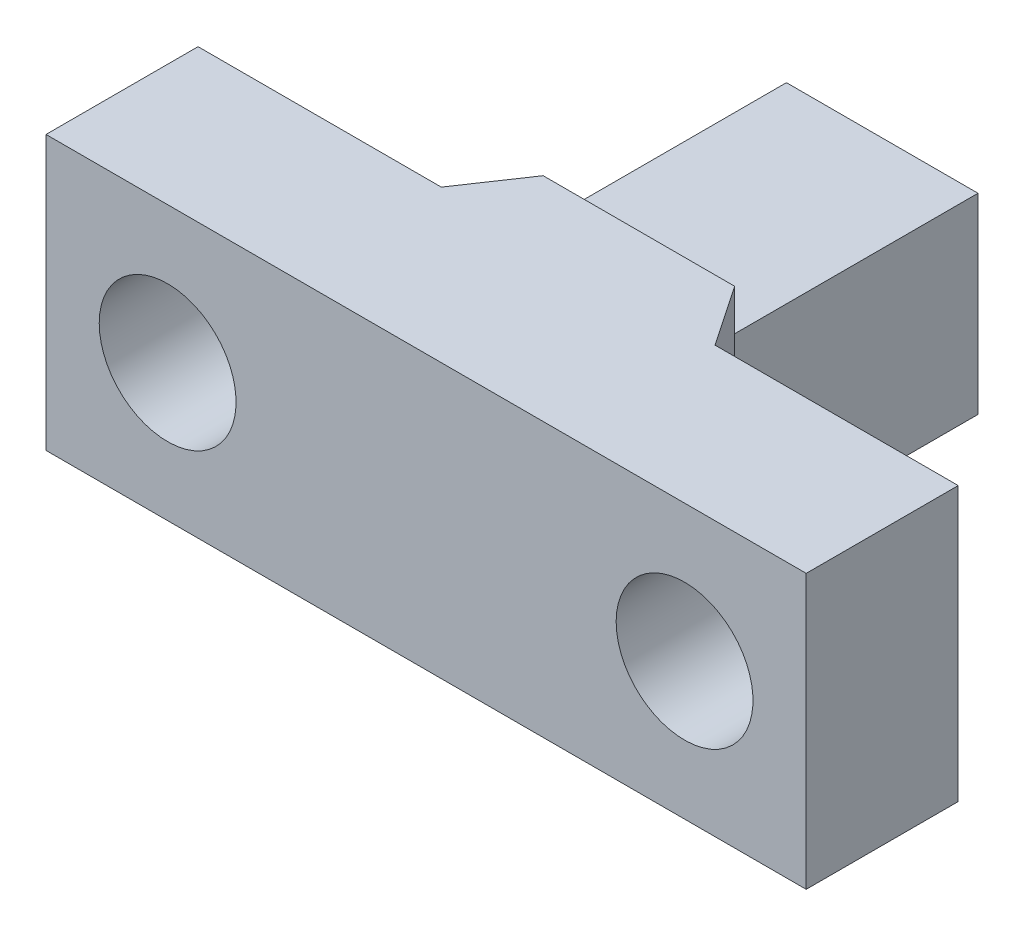
ISO-10303-21;
HEADER;
FILE_DESCRIPTION(('STEP AP214'),'2;1');
FILE_NAME('part.step','',(''),(''),'','','');
FILE_SCHEMA(('AUTOMOTIVE_DESIGN { 1 0 10303 214 1 1 1 1 }'));
ENDSEC;
DATA;
#1=APPLICATION_CONTEXT('core data for automotive mechanical design processes');
#2=APPLICATION_PROTOCOL_DEFINITION('international standard','automotive_design',2000,#1);
#3=PRODUCT_CONTEXT('',#1,'mechanical');
#4=PRODUCT('Part','Part','',(#3));
#5=PRODUCT_RELATED_PRODUCT_CATEGORY('part','',(#4));
#6=PRODUCT_DEFINITION_FORMATION('','',#4);
#7=PRODUCT_DEFINITION_CONTEXT('part definition',#1,'design');
#8=PRODUCT_DEFINITION('design','',#6,#7);
#9=PRODUCT_DEFINITION_SHAPE('','',#8);
#10=(LENGTH_UNIT() NAMED_UNIT(*) SI_UNIT(.MILLI.,.METRE.));
#11=(NAMED_UNIT(*) PLANE_ANGLE_UNIT() SI_UNIT($,.RADIAN.));
#12=(NAMED_UNIT(*) SI_UNIT($,.STERADIAN.) SOLID_ANGLE_UNIT());
#13=UNCERTAINTY_MEASURE_WITH_UNIT(LENGTH_MEASURE(1.E-05),#10,'distance_accuracy_value','');
#14=(GEOMETRIC_REPRESENTATION_CONTEXT(3) GLOBAL_UNCERTAINTY_ASSIGNED_CONTEXT((#13)) GLOBAL_UNIT_ASSIGNED_CONTEXT((#10,
#11,#12)) REPRESENTATION_CONTEXT('',''));
#15=CARTESIAN_POINT('',(0.,0.,0.));
#16=DIRECTION('',(0.,0.,1.));
#17=DIRECTION('',(1.,0.,0.));
#18=AXIS2_PLACEMENT_3D('',#15,#16,#17);
#19=CARTESIAN_POINT('',(0.,0.,-7.));
#20=DIRECTION('',(0.,0.,-1.));
#21=DIRECTION('',(-1.,0.,0.));
#22=AXIS2_PLACEMENT_3D('',#19,#20,#21);
#23=PLANE('',#22);
#24=DIRECTION('',(-1.,0.,0.));
#25=VECTOR('',#24,1.);
#26=CARTESIAN_POINT('',(17.,0.,-7.));
#27=LINE('',#26,#25);
#28=CARTESIAN_POINT('',(15.65,0.,-7.));
#29=VERTEX_POINT('',#28);
#30=CARTESIAN_POINT('',(9.35,0.,-7.));
#31=VERTEX_POINT('',#30);
#32=EDGE_CURVE('E201',#29,#31,#27,.T.);
#33=ORIENTED_EDGE('',*,*,#32,.T.);
#34=DIRECTION('',(0.,1.,0.));
#35=VECTOR('',#34,1.);
#36=CARTESIAN_POINT('',(9.35,9.,-7.));
#37=LINE('',#36,#35);
#38=CARTESIAN_POINT('',(9.35,1.35,-7.));
#39=VERTEX_POINT('',#38);
#40=EDGE_CURVE('E155',#31,#39,#37,.T.);
#41=ORIENTED_EDGE('',*,*,#40,.T.);
#42=DIRECTION('',(-1.,0.,0.));
#43=VECTOR('',#42,1.);
#44=CARTESIAN_POINT('',(15.65,1.35,-7.));
#45=LINE('',#44,#43);
#46=CARTESIAN_POINT('',(15.65,1.35,-7.));
#47=VERTEX_POINT('',#46);
#48=EDGE_CURVE('E137',#47,#39,#45,.T.);
#49=ORIENTED_EDGE('',*,*,#48,.F.);
#50=DIRECTION('',(0.,-1.,0.));
#51=VECTOR('',#50,1.);
#52=CARTESIAN_POINT('',(15.65,0.,-7.));
#53=LINE('',#52,#51);
#54=EDGE_CURVE('E152',#47,#29,#53,.T.);
#55=ORIENTED_EDGE('',*,*,#54,.T.);
#56=EDGE_LOOP('',(#33,#41,#49,#55));
#57=FACE_BOUND('',#56,.T.);
#58=ADVANCED_FACE('F42',(#57),#23,.T.);
#59=CARTESIAN_POINT('',(0.,9.,0.));
#60=DIRECTION('',(0.,1.,0.));
#61=DIRECTION('',(0.,0.,1.));
#62=AXIS2_PLACEMENT_3D('',#59,#60,#61);
#63=PLANE('',#62);
#64=DIRECTION('',(1.,0.,0.));
#65=VECTOR('',#64,1.);
#66=CARTESIAN_POINT('',(17.,9.,-7.));
#67=LINE('',#66,#65);
#68=CARTESIAN_POINT('',(9.35,9.,-7.));
#69=VERTEX_POINT('',#68);
#70=CARTESIAN_POINT('',(15.65,9.,-7.));
#71=VERTEX_POINT('',#70);
#72=EDGE_CURVE('E258',#69,#71,#67,.T.);
#73=ORIENTED_EDGE('',*,*,#72,.F.);
#74=DIRECTION('',(-0.559472855001061,0.,0.828848674075649));
#75=VECTOR('',#74,1.);
#76=CARTESIAN_POINT('',(3.17732932589096,9.,2.14469729497639));
#77=LINE('',#76,#75);
#78=CARTESIAN_POINT('',(8.,9.,-5.));
#79=VERTEX_POINT('',#78);
#80=EDGE_CURVE('E191',#69,#79,#77,.T.);
#81=ORIENTED_EDGE('',*,*,#80,.T.);
#82=DIRECTION('',(-1.,0.,0.));
#83=VECTOR('',#82,1.);
#84=CARTESIAN_POINT('',(8.,9.,-5.));
#85=LINE('',#84,#83);
#86=CARTESIAN_POINT('',(0.,9.,-5.));
#87=VERTEX_POINT('',#86);
#88=EDGE_CURVE('E244',#79,#87,#85,.T.);
#89=ORIENTED_EDGE('',*,*,#88,.T.);
#90=DIRECTION('',(0.,0.,1.));
#91=VECTOR('',#90,1.);
#92=CARTESIAN_POINT('',(0.,9.,-5.));
#93=LINE('',#92,#91);
#94=CARTESIAN_POINT('',(0.,9.,0.));
#95=VERTEX_POINT('',#94);
#96=EDGE_CURVE('E241',#87,#95,#93,.T.);
#97=ORIENTED_EDGE('',*,*,#96,.T.);
#98=DIRECTION('',(1.,0.,0.));
#99=VECTOR('',#98,1.);
#100=CARTESIAN_POINT('',(0.,9.,0.));
#101=LINE('',#100,#99);
#102=CARTESIAN_POINT('',(25.,9.,0.));
#103=VERTEX_POINT('',#102);
#104=EDGE_CURVE('E267',#95,#103,#101,.T.);
#105=ORIENTED_EDGE('',*,*,#104,.T.);
#106=DIRECTION('',(0.,0.,-1.));
#107=VECTOR('',#106,1.);
#108=CARTESIAN_POINT('',(25.,9.,0.));
#109=LINE('',#108,#107);
#110=CARTESIAN_POINT('',(25.,9.,-5.));
#111=VERTEX_POINT('',#110);
#112=EDGE_CURVE('E229',#103,#111,#109,.T.);
#113=ORIENTED_EDGE('',*,*,#112,.T.);
#114=DIRECTION('',(-1.,0.,0.));
#115=VECTOR('',#114,1.);
#116=CARTESIAN_POINT('',(25.,9.,-5.));
#117=LINE('',#116,#115);
#118=CARTESIAN_POINT('',(17.,9.,-5.));
#119=VERTEX_POINT('',#118);
#120=EDGE_CURVE('E250',#111,#119,#117,.T.);
#121=ORIENTED_EDGE('',*,*,#120,.T.);
#122=DIRECTION('',(-0.559472855001065,0.,-0.828848674075647));
#123=VECTOR('',#122,1.);
#124=CARTESIAN_POINT('',(13.997423787033,9.,-9.44826105624736));
#125=LINE('',#124,#123);
#126=EDGE_CURVE('E59',#119,#71,#125,.T.);
#127=ORIENTED_EDGE('',*,*,#126,.T.);
#128=EDGE_LOOP('',(#73,#81,#89,#97,#105,#113,#121,#127));
#129=FACE_BOUND('',#128,.T.);
#130=ADVANCED_FACE('F270',(#129),#63,.T.);
#131=CARTESIAN_POINT('',(0.,0.,0.));
#132=DIRECTION('',(0.,1.,0.));
#133=DIRECTION('',(0.,0.,1.));
#134=AXIS2_PLACEMENT_3D('',#131,#132,#133);
#135=PLANE('',#134);
#136=DIRECTION('',(-1.,0.,0.));
#137=VECTOR('',#136,1.);
#138=CARTESIAN_POINT('',(8.,0.,-5.));
#139=LINE('',#138,#137);
#140=CARTESIAN_POINT('',(8.,0.,-5.));
#141=VERTEX_POINT('',#140);
#142=CARTESIAN_POINT('',(0.,0.,-5.));
#143=VERTEX_POINT('',#142);
#144=EDGE_CURVE('E211',#141,#143,#139,.T.);
#145=ORIENTED_EDGE('',*,*,#144,.F.);
#146=DIRECTION('',(0.559472855001061,0.,-0.828848674075649));
#147=VECTOR('',#146,1.);
#148=CARTESIAN_POINT('',(9.35,0.,-7.));
#149=LINE('',#148,#147);
#150=EDGE_CURVE('E11',#141,#31,#149,.T.);
#151=ORIENTED_EDGE('',*,*,#150,.T.);
#152=ORIENTED_EDGE('',*,*,#32,.F.);
#153=DIRECTION('',(0.559472855001065,0.,0.828848674075647));
#154=VECTOR('',#153,1.);
#155=CARTESIAN_POINT('',(15.65,0.,-7.));
#156=LINE('',#155,#154);
#157=CARTESIAN_POINT('',(17.,0.,-5.));
#158=VERTEX_POINT('',#157);
#159=EDGE_CURVE('E52',#29,#158,#156,.T.);
#160=ORIENTED_EDGE('',*,*,#159,.T.);
#161=DIRECTION('',(-1.,0.,0.));
#162=VECTOR('',#161,1.);
#163=CARTESIAN_POINT('',(25.,0.,-5.));
#164=LINE('',#163,#162);
#165=CARTESIAN_POINT('',(25.,0.,-5.));
#166=VERTEX_POINT('',#165);
#167=EDGE_CURVE('E200',#166,#158,#164,.T.);
#168=ORIENTED_EDGE('',*,*,#167,.F.);
#169=DIRECTION('',(0.,0.,-1.));
#170=VECTOR('',#169,1.);
#171=CARTESIAN_POINT('',(25.,0.,0.));
#172=LINE('',#171,#170);
#173=CARTESIAN_POINT('',(25.,0.,0.));
#174=VERTEX_POINT('',#173);
#175=EDGE_CURVE('E212',#174,#166,#172,.T.);
#176=ORIENTED_EDGE('',*,*,#175,.F.);
#177=DIRECTION('',(1.,0.,0.));
#178=VECTOR('',#177,1.);
#179=CARTESIAN_POINT('',(0.,0.,0.));
#180=LINE('',#179,#178);
#181=CARTESIAN_POINT('',(0.,0.,0.));
#182=VERTEX_POINT('',#181);
#183=EDGE_CURVE('E232',#182,#174,#180,.T.);
#184=ORIENTED_EDGE('',*,*,#183,.F.);
#185=DIRECTION('',(0.,0.,1.));
#186=VECTOR('',#185,1.);
#187=CARTESIAN_POINT('',(0.,0.,-5.));
#188=LINE('',#187,#186);
#189=EDGE_CURVE('E236',#143,#182,#188,.T.);
#190=ORIENTED_EDGE('',*,*,#189,.F.);
#191=EDGE_LOOP('',(#145,#151,#152,#160,#168,#176,#184,#190));
#192=FACE_BOUND('',#191,.T.);
#193=ADVANCED_FACE('F198',(#192),#135,.F.);
#194=CARTESIAN_POINT('',(0.,9.,-5.));
#195=DIRECTION('',(1.,0.,0.));
#196=DIRECTION('',(0.,0.,-1.));
#197=AXIS2_PLACEMENT_3D('',#194,#195,#196);
#198=PLANE('',#197);
#199=ORIENTED_EDGE('',*,*,#189,.T.);
#200=DIRECTION('',(0.,-1.,0.));
#201=VECTOR('',#200,1.);
#202=CARTESIAN_POINT('',(0.,9.,0.));
#203=LINE('',#202,#201);
#204=EDGE_CURVE('E175',#95,#182,#203,.T.);
#205=ORIENTED_EDGE('',*,*,#204,.F.);
#206=ORIENTED_EDGE('',*,*,#96,.F.);
#207=DIRECTION('',(0.,-1.,0.));
#208=VECTOR('',#207,1.);
#209=CARTESIAN_POINT('',(0.,9.,-5.));
#210=LINE('',#209,#208);
#211=EDGE_CURVE('E220',#87,#143,#210,.T.);
#212=ORIENTED_EDGE('',*,*,#211,.T.);
#213=EDGE_LOOP('',(#199,#205,#206,#212));
#214=FACE_BOUND('',#213,.T.);
#215=ADVANCED_FACE('F272',(#214),#198,.F.);
#216=CARTESIAN_POINT('',(0.,9.,0.));
#217=DIRECTION('',(0.,0.,-1.));
#218=DIRECTION('',(-1.,0.,0.));
#219=AXIS2_PLACEMENT_3D('',#216,#217,#218);
#220=PLANE('',#219);
#221=CARTESIAN_POINT('',(4.,4.5,0.));
#222=DIRECTION('',(0.,0.,-1.));
#223=DIRECTION('',(-1.,0.,0.));
#224=AXIS2_PLACEMENT_3D('',#221,#222,#223);
#225=CIRCLE('',#224,2.25);
#226=CARTESIAN_POINT('',(1.75,4.5,0.));
#227=VERTEX_POINT('',#226);
#228=EDGE_CURVE('E464',#227,#227,#225,.T.);
#229=ORIENTED_EDGE('',*,*,#228,.T.);
#230=EDGE_LOOP('',(#229));
#231=FACE_BOUND('',#230,.T.);
#232=CARTESIAN_POINT('',(21.,4.5,0.));
#233=DIRECTION('',(0.,0.,-1.));
#234=DIRECTION('',(-1.,0.,0.));
#235=AXIS2_PLACEMENT_3D('',#232,#233,#234);
#236=CIRCLE('',#235,2.25);
#237=CARTESIAN_POINT('',(18.75,4.5,0.));
#238=VERTEX_POINT('',#237);
#239=EDGE_CURVE('E453',#238,#238,#236,.T.);
#240=ORIENTED_EDGE('',*,*,#239,.T.);
#241=EDGE_LOOP('',(#240));
#242=FACE_BOUND('',#241,.T.);
#243=ORIENTED_EDGE('',*,*,#183,.T.);
#244=DIRECTION('',(0.,-1.,0.));
#245=VECTOR('',#244,1.);
#246=CARTESIAN_POINT('',(25.,9.,0.));
#247=LINE('',#246,#245);
#248=EDGE_CURVE('E181',#103,#174,#247,.T.);
#249=ORIENTED_EDGE('',*,*,#248,.F.);
#250=ORIENTED_EDGE('',*,*,#104,.F.);
#251=ORIENTED_EDGE('',*,*,#204,.T.);
#252=EDGE_LOOP('',(#243,#249,#250,#251));
#253=FACE_BOUND('',#252,.T.);
#254=ADVANCED_FACE('F271',(#231,#242,#253),#220,.F.);
#255=CARTESIAN_POINT('',(25.,9.,0.));
#256=DIRECTION('',(-1.,0.,0.));
#257=DIRECTION('',(0.,0.,1.));
#258=AXIS2_PLACEMENT_3D('',#255,#256,#257);
#259=PLANE('',#258);
#260=ORIENTED_EDGE('',*,*,#175,.T.);
#261=DIRECTION('',(0.,-1.,0.));
#262=VECTOR('',#261,1.);
#263=CARTESIAN_POINT('',(25.,9.,-5.));
#264=LINE('',#263,#262);
#265=EDGE_CURVE('E209',#111,#166,#264,.T.);
#266=ORIENTED_EDGE('',*,*,#265,.F.);
#267=ORIENTED_EDGE('',*,*,#112,.F.);
#268=ORIENTED_EDGE('',*,*,#248,.T.);
#269=EDGE_LOOP('',(#260,#266,#267,#268));
#270=FACE_BOUND('',#269,.T.);
#271=ADVANCED_FACE('F228',(#270),#259,.F.);
#272=CARTESIAN_POINT('',(25.,9.,-5.));
#273=DIRECTION('',(0.,0.,1.));
#274=DIRECTION('',(1.,0.,0.));
#275=AXIS2_PLACEMENT_3D('',#272,#273,#274);
#276=PLANE('',#275);
#277=CARTESIAN_POINT('',(21.,4.5,-5.));
#278=DIRECTION('',(0.,0.,-1.));
#279=DIRECTION('',(-1.,0.,0.));
#280=AXIS2_PLACEMENT_3D('',#277,#278,#279);
#281=CIRCLE('',#280,2.25);
#282=CARTESIAN_POINT('',(18.75,4.5,-5.));
#283=VERTEX_POINT('',#282);
#284=EDGE_CURVE('E451',#283,#283,#281,.T.);
#285=ORIENTED_EDGE('',*,*,#284,.F.);
#286=EDGE_LOOP('',(#285));
#287=FACE_BOUND('',#286,.T.);
#288=ORIENTED_EDGE('',*,*,#167,.T.);
#289=DIRECTION('',(0.,-1.,0.));
#290=VECTOR('',#289,1.);
#291=CARTESIAN_POINT('',(17.,9.,-5.));
#292=LINE('',#291,#290);
#293=EDGE_CURVE('E207',#119,#158,#292,.T.);
#294=ORIENTED_EDGE('',*,*,#293,.F.);
#295=ORIENTED_EDGE('',*,*,#120,.F.);
#296=ORIENTED_EDGE('',*,*,#265,.T.);
#297=EDGE_LOOP('',(#288,#294,#295,#296));
#298=FACE_BOUND('',#297,.T.);
#299=ADVANCED_FACE('F205',(#287,#298),#276,.F.);
#300=CARTESIAN_POINT('',(8.,9.,-5.));
#301=DIRECTION('',(0.,0.,1.));
#302=DIRECTION('',(1.,0.,0.));
#303=AXIS2_PLACEMENT_3D('',#300,#301,#302);
#304=PLANE('',#303);
#305=CARTESIAN_POINT('',(4.,4.5,-5.));
#306=DIRECTION('',(0.,0.,-1.));
#307=DIRECTION('',(-1.,0.,0.));
#308=AXIS2_PLACEMENT_3D('',#305,#306,#307);
#309=CIRCLE('',#308,2.25);
#310=CARTESIAN_POINT('',(1.75,4.5,-5.));
#311=VERTEX_POINT('',#310);
#312=EDGE_CURVE('E457',#311,#311,#309,.T.);
#313=ORIENTED_EDGE('',*,*,#312,.F.);
#314=EDGE_LOOP('',(#313));
#315=FACE_BOUND('',#314,.T.);
#316=ORIENTED_EDGE('',*,*,#144,.T.);
#317=ORIENTED_EDGE('',*,*,#211,.F.);
#318=ORIENTED_EDGE('',*,*,#88,.F.);
#319=DIRECTION('',(0.,-1.,0.));
#320=VECTOR('',#319,1.);
#321=CARTESIAN_POINT('',(8.,9.,-5.));
#322=LINE('',#321,#320);
#323=EDGE_CURVE('E215',#79,#141,#322,.T.);
#324=ORIENTED_EDGE('',*,*,#323,.T.);
#325=EDGE_LOOP('',(#316,#317,#318,#324));
#326=FACE_BOUND('',#325,.T.);
#327=ADVANCED_FACE('F291',(#315,#326),#304,.F.);
#328=DIRECTION('',(1.,0.,0.));
#329=VECTOR('',#328,1.);
#330=CARTESIAN_POINT('',(15.65,7.65,-7.));
#331=LINE('',#330,#329);
#332=CARTESIAN_POINT('',(9.35,7.65,-7.));
#333=VERTEX_POINT('',#332);
#334=CARTESIAN_POINT('',(15.65,7.65,-7.));
#335=VERTEX_POINT('',#334);
#336=EDGE_CURVE('E146',#333,#335,#331,.T.);
#337=ORIENTED_EDGE('',*,*,#336,.F.);
#338=DIRECTION('',(0.,1.,0.));
#339=VECTOR('',#338,1.);
#340=CARTESIAN_POINT('',(9.35,9.,-7.));
#341=LINE('',#340,#339);
#342=EDGE_CURVE('E66',#333,#69,#341,.T.);
#343=ORIENTED_EDGE('',*,*,#342,.T.);
#344=ORIENTED_EDGE('',*,*,#72,.T.);
#345=DIRECTION('',(0.,-1.,0.));
#346=VECTOR('',#345,1.);
#347=CARTESIAN_POINT('',(15.65,0.,-7.));
#348=LINE('',#347,#346);
#349=EDGE_CURVE('E174',#71,#335,#348,.T.);
#350=ORIENTED_EDGE('',*,*,#349,.T.);
#351=EDGE_LOOP('',(#337,#343,#344,#350));
#352=FACE_BOUND('',#351,.T.);
#353=ADVANCED_FACE('F284',(#352),#23,.T.);
#354=CARTESIAN_POINT('',(15.65,7.65,-7.));
#355=DIRECTION('',(1.,0.,0.));
#356=DIRECTION('',(0.,0.,-1.));
#357=AXIS2_PLACEMENT_3D('',#354,#355,#356);
#358=PLANE('',#357);
#359=DIRECTION('',(0.,-1.,0.));
#360=VECTOR('',#359,1.);
#361=CARTESIAN_POINT('',(15.65,7.65,-15.));
#362=LINE('',#361,#360);
#363=CARTESIAN_POINT('',(15.65,7.65,-15.));
#364=VERTEX_POINT('',#363);
#365=CARTESIAN_POINT('',(15.65,1.35,-15.));
#366=VERTEX_POINT('',#365);
#367=EDGE_CURVE('E461',#364,#366,#362,.T.);
#368=ORIENTED_EDGE('',*,*,#367,.F.);
#369=DIRECTION('',(0.,0.,-1.));
#370=VECTOR('',#369,1.);
#371=CARTESIAN_POINT('',(15.65,7.65,-7.));
#372=LINE('',#371,#370);
#373=EDGE_CURVE('E163',#335,#364,#372,.T.);
#374=ORIENTED_EDGE('',*,*,#373,.F.);
#375=DIRECTION('',(0.,-1.,0.));
#376=VECTOR('',#375,1.);
#377=CARTESIAN_POINT('',(15.65,7.65,-7.));
#378=LINE('',#377,#376);
#379=EDGE_CURVE('E159',#335,#47,#378,.T.);
#380=ORIENTED_EDGE('',*,*,#379,.T.);
#381=DIRECTION('',(0.,0.,-1.));
#382=VECTOR('',#381,1.);
#383=CARTESIAN_POINT('',(15.65,1.35,-7.));
#384=LINE('',#383,#382);
#385=EDGE_CURVE('E133',#47,#366,#384,.T.);
#386=ORIENTED_EDGE('',*,*,#385,.T.);
#387=EDGE_LOOP('',(#368,#374,#380,#386));
#388=FACE_BOUND('',#387,.T.);
#389=ADVANCED_FACE('F162',(#388),#358,.T.);
#390=CARTESIAN_POINT('',(15.65,7.65,-7.));
#391=DIRECTION('',(0.,1.,0.));
#392=DIRECTION('',(0.,0.,1.));
#393=AXIS2_PLACEMENT_3D('',#390,#391,#392);
#394=PLANE('',#393);
#395=DIRECTION('',(1.,0.,0.));
#396=VECTOR('',#395,1.);
#397=CARTESIAN_POINT('',(15.65,7.65,-15.));
#398=LINE('',#397,#396);
#399=CARTESIAN_POINT('',(9.35,7.65,-15.));
#400=VERTEX_POINT('',#399);
#401=EDGE_CURVE('E169',#400,#364,#398,.T.);
#402=ORIENTED_EDGE('',*,*,#401,.F.);
#403=DIRECTION('',(0.,0.,-1.));
#404=VECTOR('',#403,1.);
#405=CARTESIAN_POINT('',(9.35,7.65,-7.));
#406=LINE('',#405,#404);
#407=EDGE_CURVE('E305',#333,#400,#406,.T.);
#408=ORIENTED_EDGE('',*,*,#407,.F.);
#409=ORIENTED_EDGE('',*,*,#336,.T.);
#410=ORIENTED_EDGE('',*,*,#373,.T.);
#411=EDGE_LOOP('',(#402,#408,#409,#410));
#412=FACE_BOUND('',#411,.T.);
#413=ADVANCED_FACE('F296',(#412),#394,.T.);
#414=CARTESIAN_POINT('',(9.35,7.65,-7.));
#415=DIRECTION('',(-1.,0.,0.));
#416=DIRECTION('',(0.,0.,1.));
#417=AXIS2_PLACEMENT_3D('',#414,#415,#416);
#418=PLANE('',#417);
#419=DIRECTION('',(0.,1.,0.));
#420=VECTOR('',#419,1.);
#421=CARTESIAN_POINT('',(9.35,7.65,-15.));
#422=LINE('',#421,#420);
#423=CARTESIAN_POINT('',(9.35,1.35,-15.));
#424=VERTEX_POINT('',#423);
#425=EDGE_CURVE('E467',#424,#400,#422,.T.);
#426=ORIENTED_EDGE('',*,*,#425,.F.);
#427=DIRECTION('',(0.,0.,-1.));
#428=VECTOR('',#427,1.);
#429=CARTESIAN_POINT('',(9.35,1.35,-7.));
#430=LINE('',#429,#428);
#431=EDGE_CURVE('E145',#39,#424,#430,.T.);
#432=ORIENTED_EDGE('',*,*,#431,.F.);
#433=DIRECTION('',(0.,1.,0.));
#434=VECTOR('',#433,1.);
#435=CARTESIAN_POINT('',(9.35,7.65,-7.));
#436=LINE('',#435,#434);
#437=EDGE_CURVE('E158',#39,#333,#436,.T.);
#438=ORIENTED_EDGE('',*,*,#437,.T.);
#439=ORIENTED_EDGE('',*,*,#407,.T.);
#440=EDGE_LOOP('',(#426,#432,#438,#439));
#441=FACE_BOUND('',#440,.T.);
#442=ADVANCED_FACE('F304',(#441),#418,.T.);
#443=CARTESIAN_POINT('',(15.65,1.35,-7.));
#444=DIRECTION('',(0.,-1.,0.));
#445=DIRECTION('',(0.,0.,-1.));
#446=AXIS2_PLACEMENT_3D('',#443,#444,#445);
#447=PLANE('',#446);
#448=DIRECTION('',(-1.,0.,0.));
#449=VECTOR('',#448,1.);
#450=CARTESIAN_POINT('',(15.65,1.35,-15.));
#451=LINE('',#450,#449);
#452=EDGE_CURVE('E139',#366,#424,#451,.T.);
#453=ORIENTED_EDGE('',*,*,#452,.F.);
#454=ORIENTED_EDGE('',*,*,#385,.F.);
#455=ORIENTED_EDGE('',*,*,#48,.T.);
#456=ORIENTED_EDGE('',*,*,#431,.T.);
#457=EDGE_LOOP('',(#453,#454,#455,#456));
#458=FACE_BOUND('',#457,.T.);
#459=ADVANCED_FACE('F135',(#458),#447,.T.);
#460=CARTESIAN_POINT('',(8.,9.,-15.));
#461=DIRECTION('',(0.,0.,1.));
#462=DIRECTION('',(1.,0.,0.));
#463=AXIS2_PLACEMENT_3D('',#460,#461,#462);
#464=PLANE('',#463);
#465=ORIENTED_EDGE('',*,*,#367,.T.);
#466=ORIENTED_EDGE('',*,*,#452,.T.);
#467=ORIENTED_EDGE('',*,*,#425,.T.);
#468=ORIENTED_EDGE('',*,*,#401,.T.);
#469=EDGE_LOOP('',(#465,#466,#467,#468));
#470=FACE_BOUND('',#469,.T.);
#471=ADVANCED_FACE('F332',(#470),#464,.F.);
#472=CARTESIAN_POINT('',(4.,4.5,0.));
#473=DIRECTION('',(0.,0.,-1.));
#474=DIRECTION('',(-1.,0.,0.));
#475=AXIS2_PLACEMENT_3D('',#472,#473,#474);
#476=CYLINDRICAL_SURFACE('',#475,2.25);
#477=ORIENTED_EDGE('',*,*,#228,.F.);
#478=EDGE_LOOP('',(#477));
#479=FACE_BOUND('',#478,.T.);
#480=ORIENTED_EDGE('',*,*,#312,.T.);
#481=EDGE_LOOP('',(#480));
#482=FACE_BOUND('',#481,.T.);
#483=ADVANCED_FACE('F321',(#479,#482),#476,.F.);
#484=CARTESIAN_POINT('',(21.,4.5,0.));
#485=DIRECTION('',(0.,0.,-1.));
#486=DIRECTION('',(-1.,0.,0.));
#487=AXIS2_PLACEMENT_3D('',#484,#485,#486);
#488=CYLINDRICAL_SURFACE('',#487,2.25);
#489=ORIENTED_EDGE('',*,*,#239,.F.);
#490=EDGE_LOOP('',(#489));
#491=FACE_BOUND('',#490,.T.);
#492=ORIENTED_EDGE('',*,*,#284,.T.);
#493=EDGE_LOOP('',(#492));
#494=FACE_BOUND('',#493,.T.);
#495=ADVANCED_FACE('F316',(#491,#494),#488,.F.);
#496=CARTESIAN_POINT('',(9.35,0.,-7.));
#497=DIRECTION('',(-0.828848674075649,0.,-0.559472855001061));
#498=DIRECTION('',(0.,-1.,0.));
#499=AXIS2_PLACEMENT_3D('',#496,#497,#498);
#500=PLANE('',#499);
#501=ORIENTED_EDGE('',*,*,#150,.F.);
#502=ORIENTED_EDGE('',*,*,#323,.F.);
#503=ORIENTED_EDGE('',*,*,#80,.F.);
#504=ORIENTED_EDGE('',*,*,#342,.F.);
#505=ORIENTED_EDGE('',*,*,#437,.F.);
#506=ORIENTED_EDGE('',*,*,#40,.F.);
#507=EDGE_LOOP('',(#501,#502,#503,#504,#505,#506));
#508=FACE_BOUND('',#507,.T.);
#509=ADVANCED_FACE('F312',(#508),#500,.T.);
#510=CARTESIAN_POINT('',(15.65,0.,-7.));
#511=DIRECTION('',(0.828848674075647,0.,-0.559472855001065));
#512=DIRECTION('',(0.,1.,0.));
#513=AXIS2_PLACEMENT_3D('',#510,#511,#512);
#514=PLANE('',#513);
#515=ORIENTED_EDGE('',*,*,#126,.F.);
#516=ORIENTED_EDGE('',*,*,#293,.T.);
#517=ORIENTED_EDGE('',*,*,#159,.F.);
#518=ORIENTED_EDGE('',*,*,#54,.F.);
#519=ORIENTED_EDGE('',*,*,#379,.F.);
#520=ORIENTED_EDGE('',*,*,#349,.F.);
#521=EDGE_LOOP('',(#515,#516,#517,#518,#519,#520));
#522=FACE_BOUND('',#521,.T.);
#523=ADVANCED_FACE('F45',(#522),#514,.T.);
#524=CLOSED_SHELL('',(#58,#130,#193,#215,#254,#271,#299,#327,#353,#389,#413,#442,#459,#471,#483,
#495,#509,#523));
#525=MANIFOLD_SOLID_BREP('B2',#524);
#526=ADVANCED_BREP_SHAPE_REPRESENTATION('',(#18,#525),#14);
#527=SHAPE_DEFINITION_REPRESENTATION(#9,#526);
ENDSEC;
END-ISO-10303-21;
